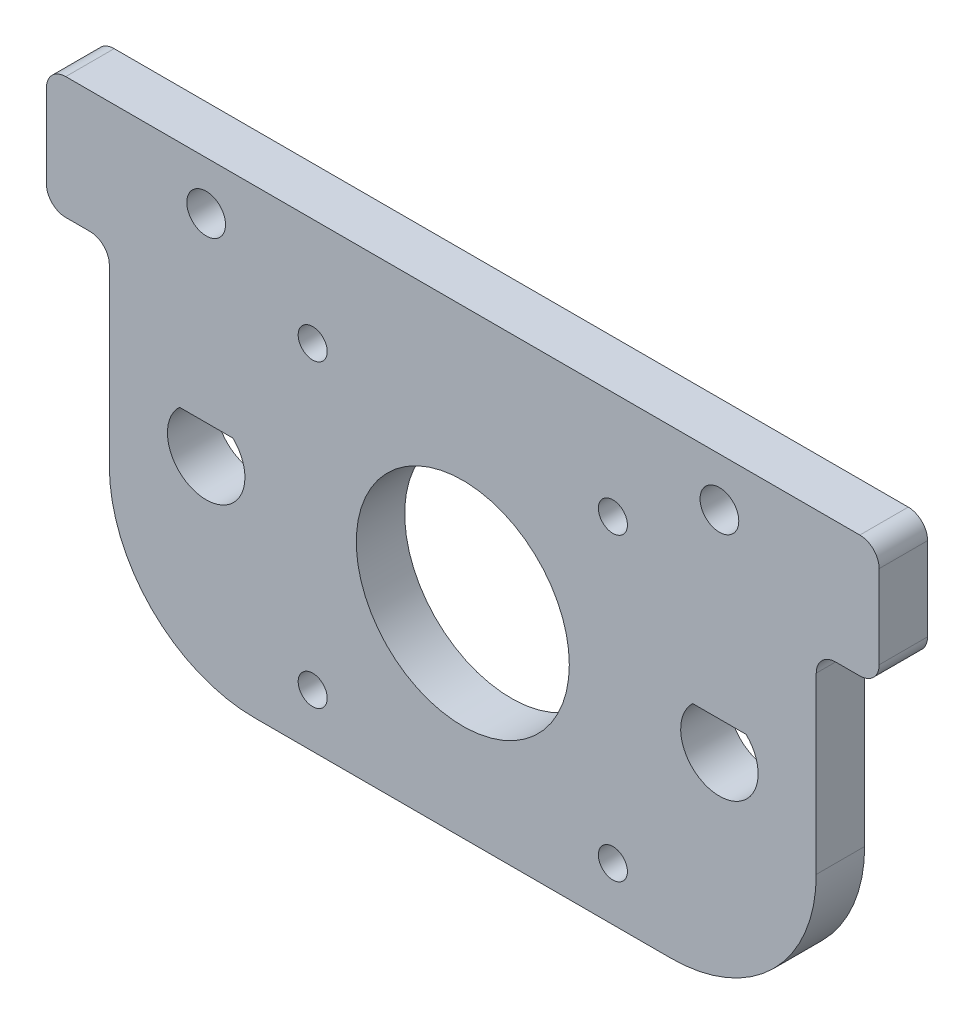
ISO-10303-21;
HEADER;
FILE_DESCRIPTION(('STEP AP214'),'2;1');
FILE_NAME('part.step','',(''),(''),'','','');
FILE_SCHEMA(('AUTOMOTIVE_DESIGN { 1 0 10303 214 1 1 1 1 }'));
ENDSEC;
DATA;
#1=APPLICATION_CONTEXT('core data for automotive mechanical design processes');
#2=APPLICATION_PROTOCOL_DEFINITION('international standard','automotive_design',2000,#1);
#3=PRODUCT_CONTEXT('',#1,'mechanical');
#4=PRODUCT('Part','Part','',(#3));
#5=PRODUCT_RELATED_PRODUCT_CATEGORY('part','',(#4));
#6=PRODUCT_DEFINITION_FORMATION('','',#4);
#7=PRODUCT_DEFINITION_CONTEXT('part definition',#1,'design');
#8=PRODUCT_DEFINITION('design','',#6,#7);
#9=PRODUCT_DEFINITION_SHAPE('','',#8);
#10=(LENGTH_UNIT() NAMED_UNIT(*) SI_UNIT(.MILLI.,.METRE.));
#11=(NAMED_UNIT(*) PLANE_ANGLE_UNIT() SI_UNIT($,.RADIAN.));
#12=(NAMED_UNIT(*) SI_UNIT($,.STERADIAN.) SOLID_ANGLE_UNIT());
#13=UNCERTAINTY_MEASURE_WITH_UNIT(LENGTH_MEASURE(1.E-05),#10,'distance_accuracy_value','');
#14=(GEOMETRIC_REPRESENTATION_CONTEXT(3) GLOBAL_UNCERTAINTY_ASSIGNED_CONTEXT((#13)) GLOBAL_UNIT_ASSIGNED_CONTEXT((#10,
#11,#12)) REPRESENTATION_CONTEXT('',''));
#15=CARTESIAN_POINT('',(0.,0.,0.));
#16=DIRECTION('',(0.,0.,1.));
#17=DIRECTION('',(1.,0.,0.));
#18=AXIS2_PLACEMENT_3D('',#15,#16,#17);
#19=CARTESIAN_POINT('',(0.,0.,5.));
#20=DIRECTION('',(0.,0.,-1.));
#21=DIRECTION('',(-1.,0.,0.));
#22=AXIS2_PLACEMENT_3D('',#19,#20,#21);
#23=PLANE('',#22);
#24=CARTESIAN_POINT('',(69.5,-14.,5.));
#25=DIRECTION('',(0.,0.,1.));
#26=DIRECTION('',(1.,0.,0.));
#27=AXIS2_PLACEMENT_3D('',#24,#25,#26);
#28=CIRCLE('',#27,3.99999999999999);
#29=CARTESIAN_POINT('',(66.7450045372088,-11.1,5.));
#30=VERTEX_POINT('',#29);
#31=CARTESIAN_POINT('',(72.2549954627912,-11.1,5.));
#32=VERTEX_POINT('',#31);
#33=EDGE_CURVE('E196',#30,#32,#28,.T.);
#34=ORIENTED_EDGE('',*,*,#33,.F.);
#35=DIRECTION('',(-1.,0.,0.));
#36=VECTOR('',#35,1.);
#37=CARTESIAN_POINT('',(66.7450045372088,-11.1,5.));
#38=LINE('',#37,#36);
#39=EDGE_CURVE('E199',#32,#30,#38,.T.);
#40=ORIENTED_EDGE('',*,*,#39,.F.);
#41=EDGE_LOOP('',(#34,#40));
#42=FACE_BOUND('',#41,.T.);
#43=DIRECTION('',(1.,0.,0.));
#44=VECTOR('',#43,1.);
#45=CARTESIAN_POINT('',(6.5,-35.,5.));
#46=LINE('',#45,#44);
#47=CARTESIAN_POINT('',(21.5,-35.,5.));
#48=VERTEX_POINT('',#47);
#49=CARTESIAN_POINT('',(64.5,-35.,5.));
#50=VERTEX_POINT('',#49);
#51=EDGE_CURVE('E264',#48,#50,#46,.T.);
#52=ORIENTED_EDGE('',*,*,#51,.T.);
#53=CARTESIAN_POINT('',(64.5,-20.,5.));
#54=DIRECTION('',(0.,0.,-1.));
#55=DIRECTION('',(-1.,0.,0.));
#56=AXIS2_PLACEMENT_3D('',#53,#54,#55);
#57=CIRCLE('',#56,15.);
#58=CARTESIAN_POINT('',(79.5,-20.,5.));
#59=VERTEX_POINT('',#58);
#60=EDGE_CURVE('E41',#50,#59,#57,.F.);
#61=ORIENTED_EDGE('',*,*,#60,.T.);
#62=DIRECTION('',(0.,1.,0.));
#63=VECTOR('',#62,1.);
#64=CARTESIAN_POINT('',(79.5,0.,5.));
#65=LINE('',#64,#63);
#66=CARTESIAN_POINT('',(79.5,-2.,5.));
#67=VERTEX_POINT('',#66);
#68=EDGE_CURVE('E266',#59,#67,#65,.T.);
#69=ORIENTED_EDGE('',*,*,#68,.T.);
#70=CARTESIAN_POINT('',(81.5,-2.,5.));
#71=DIRECTION('',(0.,0.,-1.));
#72=DIRECTION('',(-1.,0.,0.));
#73=AXIS2_PLACEMENT_3D('',#70,#71,#72);
#74=CIRCLE('',#73,2.);
#75=CARTESIAN_POINT('',(81.5,0.,5.));
#76=VERTEX_POINT('',#75);
#77=EDGE_CURVE('E350',#67,#76,#74,.T.);
#78=ORIENTED_EDGE('',*,*,#77,.T.);
#79=DIRECTION('',(1.,0.,0.));
#80=VECTOR('',#79,1.);
#81=CARTESIAN_POINT('',(79.5,0.,5.));
#82=LINE('',#81,#80);
#83=CARTESIAN_POINT('',(84.,0.,5.));
#84=VERTEX_POINT('',#83);
#85=EDGE_CURVE('E268',#76,#84,#82,.T.);
#86=ORIENTED_EDGE('',*,*,#85,.T.);
#87=CARTESIAN_POINT('',(84.,2.,5.));
#88=DIRECTION('',(0.,0.,-1.));
#89=DIRECTION('',(-1.,0.,0.));
#90=AXIS2_PLACEMENT_3D('',#87,#88,#89);
#91=CIRCLE('',#90,2.);
#92=CARTESIAN_POINT('',(86.,2.,5.));
#93=VERTEX_POINT('',#92);
#94=EDGE_CURVE('E331',#84,#93,#91,.F.);
#95=ORIENTED_EDGE('',*,*,#94,.T.);
#96=DIRECTION('',(0.,1.,0.));
#97=VECTOR('',#96,1.);
#98=CARTESIAN_POINT('',(86.,0.,5.));
#99=LINE('',#98,#97);
#100=CARTESIAN_POINT('',(86.,10.6,5.));
#101=VERTEX_POINT('',#100);
#102=EDGE_CURVE('E271',#93,#101,#99,.T.);
#103=ORIENTED_EDGE('',*,*,#102,.T.);
#104=CARTESIAN_POINT('',(84.,10.6,5.));
#105=DIRECTION('',(0.,0.,-1.));
#106=DIRECTION('',(-1.,0.,0.));
#107=AXIS2_PLACEMENT_3D('',#104,#105,#106);
#108=CIRCLE('',#107,2.);
#109=CARTESIAN_POINT('',(84.,12.6,5.));
#110=VERTEX_POINT('',#109);
#111=EDGE_CURVE('E327',#101,#110,#108,.F.);
#112=ORIENTED_EDGE('',*,*,#111,.T.);
#113=DIRECTION('',(-1.,0.,0.));
#114=VECTOR('',#113,1.);
#115=CARTESIAN_POINT('',(0.,12.6,5.));
#116=LINE('',#115,#114);
#117=CARTESIAN_POINT('',(2.,12.6,5.));
#118=VERTEX_POINT('',#117);
#119=EDGE_CURVE('E274',#110,#118,#116,.T.);
#120=ORIENTED_EDGE('',*,*,#119,.T.);
#121=CARTESIAN_POINT('',(2.,10.6,5.));
#122=DIRECTION('',(0.,0.,-1.));
#123=DIRECTION('',(-1.,0.,0.));
#124=AXIS2_PLACEMENT_3D('',#121,#122,#123);
#125=CIRCLE('',#124,2.);
#126=CARTESIAN_POINT('',(0.,10.6,5.));
#127=VERTEX_POINT('',#126);
#128=EDGE_CURVE('E325',#118,#127,#125,.F.);
#129=ORIENTED_EDGE('',*,*,#128,.T.);
#130=DIRECTION('',(0.,-1.,0.));
#131=VECTOR('',#130,1.);
#132=CARTESIAN_POINT('',(0.,0.,5.));
#133=LINE('',#132,#131);
#134=CARTESIAN_POINT('',(0.,2.,5.));
#135=VERTEX_POINT('',#134);
#136=EDGE_CURVE('E255',#127,#135,#133,.T.);
#137=ORIENTED_EDGE('',*,*,#136,.T.);
#138=CARTESIAN_POINT('',(2.,2.,5.));
#139=DIRECTION('',(0.,0.,-1.));
#140=DIRECTION('',(-1.,0.,0.));
#141=AXIS2_PLACEMENT_3D('',#138,#139,#140);
#142=CIRCLE('',#141,2.);
#143=CARTESIAN_POINT('',(2.,0.,5.));
#144=VERTEX_POINT('',#143);
#145=EDGE_CURVE('E329',#135,#144,#142,.F.);
#146=ORIENTED_EDGE('',*,*,#145,.T.);
#147=DIRECTION('',(1.,0.,0.));
#148=VECTOR('',#147,1.);
#149=CARTESIAN_POINT('',(0.,0.,5.));
#150=LINE('',#149,#148);
#151=CARTESIAN_POINT('',(4.5,0.,5.));
#152=VERTEX_POINT('',#151);
#153=EDGE_CURVE('E258',#144,#152,#150,.T.);
#154=ORIENTED_EDGE('',*,*,#153,.T.);
#155=CARTESIAN_POINT('',(4.5,-2.,5.));
#156=DIRECTION('',(0.,0.,-1.));
#157=DIRECTION('',(-1.,0.,0.));
#158=AXIS2_PLACEMENT_3D('',#155,#156,#157);
#159=CIRCLE('',#158,2.);
#160=CARTESIAN_POINT('',(6.5,-2.,5.));
#161=VERTEX_POINT('',#160);
#162=EDGE_CURVE('E345',#152,#161,#159,.T.);
#163=ORIENTED_EDGE('',*,*,#162,.T.);
#164=DIRECTION('',(0.,-1.,0.));
#165=VECTOR('',#164,1.);
#166=CARTESIAN_POINT('',(6.5,0.,5.));
#167=LINE('',#166,#165);
#168=CARTESIAN_POINT('',(6.5,-20.,5.));
#169=VERTEX_POINT('',#168);
#170=EDGE_CURVE('E262',#161,#169,#167,.T.);
#171=ORIENTED_EDGE('',*,*,#170,.T.);
#172=CARTESIAN_POINT('',(21.5,-20.,5.));
#173=DIRECTION('',(0.,0.,-1.));
#174=DIRECTION('',(-1.,0.,0.));
#175=AXIS2_PLACEMENT_3D('',#172,#173,#174);
#176=CIRCLE('',#175,15.);
#177=EDGE_CURVE('E363',#169,#48,#176,.F.);
#178=ORIENTED_EDGE('',*,*,#177,.T.);
#179=EDGE_LOOP('',(#52,#61,#69,#78,#86,#95,#103,#112,#120,#129,#137,#146,#154,#163,#171,#178));
#180=FACE_BOUND('',#179,.T.);
#181=CARTESIAN_POINT('',(69.5,7.6,5.));
#182=DIRECTION('',(0.,0.,1.));
#183=DIRECTION('',(1.,0.,0.));
#184=AXIS2_PLACEMENT_3D('',#181,#182,#183);
#185=CIRCLE('',#184,2.);
#186=CARTESIAN_POINT('',(71.5,7.6,5.));
#187=VERTEX_POINT('',#186);
#188=EDGE_CURVE('E249',#187,#187,#185,.T.);
#189=ORIENTED_EDGE('',*,*,#188,.F.);
#190=EDGE_LOOP('',(#189));
#191=FACE_BOUND('',#190,.T.);
#192=CARTESIAN_POINT('',(16.5,7.6,5.));
#193=DIRECTION('',(0.,0.,1.));
#194=DIRECTION('',(1.,0.,0.));
#195=AXIS2_PLACEMENT_3D('',#192,#193,#194);
#196=CIRCLE('',#195,2.);
#197=CARTESIAN_POINT('',(18.5,7.6,5.));
#198=VERTEX_POINT('',#197);
#199=EDGE_CURVE('E243',#198,#198,#196,.T.);
#200=ORIENTED_EDGE('',*,*,#199,.F.);
#201=EDGE_LOOP('',(#200));
#202=FACE_BOUND('',#201,.T.);
#203=CARTESIAN_POINT('',(27.5,-29.5,5.));
#204=DIRECTION('',(0.,0.,1.));
#205=DIRECTION('',(1.,0.,0.));
#206=AXIS2_PLACEMENT_3D('',#203,#204,#205);
#207=CIRCLE('',#206,1.5);
#208=CARTESIAN_POINT('',(29.,-29.5,5.));
#209=VERTEX_POINT('',#208);
#210=EDGE_CURVE('E237',#209,#209,#207,.T.);
#211=ORIENTED_EDGE('',*,*,#210,.F.);
#212=EDGE_LOOP('',(#211));
#213=FACE_BOUND('',#212,.T.);
#214=CARTESIAN_POINT('',(43.,-14.,5.));
#215=DIRECTION('',(0.,0.,1.));
#216=DIRECTION('',(1.,0.,0.));
#217=AXIS2_PLACEMENT_3D('',#214,#215,#216);
#218=CIRCLE('',#217,11.);
#219=CARTESIAN_POINT('',(54.,-14.,5.));
#220=VERTEX_POINT('',#219);
#221=EDGE_CURVE('E231',#220,#220,#218,.T.);
#222=ORIENTED_EDGE('',*,*,#221,.F.);
#223=EDGE_LOOP('',(#222));
#224=FACE_BOUND('',#223,.T.);
#225=CARTESIAN_POINT('',(58.5,-29.5,5.));
#226=DIRECTION('',(0.,0.,1.));
#227=DIRECTION('',(1.,0.,0.));
#228=AXIS2_PLACEMENT_3D('',#225,#226,#227);
#229=CIRCLE('',#228,1.5);
#230=CARTESIAN_POINT('',(60.,-29.5,5.));
#231=VERTEX_POINT('',#230);
#232=EDGE_CURVE('E225',#231,#231,#229,.T.);
#233=ORIENTED_EDGE('',*,*,#232,.F.);
#234=EDGE_LOOP('',(#233));
#235=FACE_BOUND('',#234,.T.);
#236=CARTESIAN_POINT('',(27.5,1.5,5.));
#237=DIRECTION('',(0.,0.,1.));
#238=DIRECTION('',(1.,0.,0.));
#239=AXIS2_PLACEMENT_3D('',#236,#237,#238);
#240=CIRCLE('',#239,1.5);
#241=CARTESIAN_POINT('',(29.,1.5,5.));
#242=VERTEX_POINT('',#241);
#243=EDGE_CURVE('E219',#242,#242,#240,.T.);
#244=ORIENTED_EDGE('',*,*,#243,.F.);
#245=EDGE_LOOP('',(#244));
#246=FACE_BOUND('',#245,.T.);
#247=CARTESIAN_POINT('',(58.5,1.5,5.));
#248=DIRECTION('',(0.,0.,1.));
#249=DIRECTION('',(1.,0.,0.));
#250=AXIS2_PLACEMENT_3D('',#247,#248,#249);
#251=CIRCLE('',#250,1.5);
#252=CARTESIAN_POINT('',(60.,1.5,5.));
#253=VERTEX_POINT('',#252);
#254=EDGE_CURVE('E213',#253,#253,#251,.T.);
#255=ORIENTED_EDGE('',*,*,#254,.F.);
#256=EDGE_LOOP('',(#255));
#257=FACE_BOUND('',#256,.T.);
#258=CARTESIAN_POINT('',(16.5,-14.,5.));
#259=DIRECTION('',(0.,0.,1.));
#260=DIRECTION('',(1.,0.,0.));
#261=AXIS2_PLACEMENT_3D('',#258,#259,#260);
#262=CIRCLE('',#261,3.99999999999999);
#263=CARTESIAN_POINT('',(13.7450045372088,-11.1,5.));
#264=VERTEX_POINT('',#263);
#265=CARTESIAN_POINT('',(19.2549954627912,-11.1,5.));
#266=VERTEX_POINT('',#265);
#267=EDGE_CURVE('E182',#264,#266,#262,.T.);
#268=ORIENTED_EDGE('',*,*,#267,.F.);
#269=DIRECTION('',(-1.,0.,0.));
#270=VECTOR('',#269,1.);
#271=CARTESIAN_POINT('',(13.7450045372088,-11.1,5.));
#272=LINE('',#271,#270);
#273=EDGE_CURVE('E172',#266,#264,#272,.T.);
#274=ORIENTED_EDGE('',*,*,#273,.F.);
#275=EDGE_LOOP('',(#268,#274));
#276=FACE_BOUND('',#275,.T.);
#277=ADVANCED_FACE('F33',(#42,#180,#191,#202,#213,#224,#235,#246,#257,#276),#23,.F.);
#278=CARTESIAN_POINT('',(0.,0.,0.));
#279=DIRECTION('',(0.,0.,-1.));
#280=DIRECTION('',(-1.,0.,0.));
#281=AXIS2_PLACEMENT_3D('',#278,#279,#280);
#282=PLANE('',#281);
#283=CARTESIAN_POINT('',(27.5,1.5,0.));
#284=DIRECTION('',(0.,0.,1.));
#285=DIRECTION('',(1.,0.,0.));
#286=AXIS2_PLACEMENT_3D('',#283,#284,#285);
#287=CIRCLE('',#286,1.5);
#288=CARTESIAN_POINT('',(29.,1.5,0.));
#289=VERTEX_POINT('',#288);
#290=EDGE_CURVE('E216',#289,#289,#287,.T.);
#291=ORIENTED_EDGE('',*,*,#290,.T.);
#292=EDGE_LOOP('',(#291));
#293=FACE_BOUND('',#292,.T.);
#294=CARTESIAN_POINT('',(43.,-14.,0.));
#295=DIRECTION('',(0.,0.,1.));
#296=DIRECTION('',(1.,0.,0.));
#297=AXIS2_PLACEMENT_3D('',#294,#295,#296);
#298=CIRCLE('',#297,11.);
#299=CARTESIAN_POINT('',(54.,-14.,0.));
#300=VERTEX_POINT('',#299);
#301=EDGE_CURVE('E228',#300,#300,#298,.T.);
#302=ORIENTED_EDGE('',*,*,#301,.T.);
#303=EDGE_LOOP('',(#302));
#304=FACE_BOUND('',#303,.T.);
#305=CARTESIAN_POINT('',(16.5,7.6,0.));
#306=DIRECTION('',(0.,0.,1.));
#307=DIRECTION('',(1.,0.,0.));
#308=AXIS2_PLACEMENT_3D('',#305,#306,#307);
#309=CIRCLE('',#308,2.);
#310=CARTESIAN_POINT('',(18.5,7.6,0.));
#311=VERTEX_POINT('',#310);
#312=EDGE_CURVE('E240',#311,#311,#309,.T.);
#313=ORIENTED_EDGE('',*,*,#312,.T.);
#314=EDGE_LOOP('',(#313));
#315=FACE_BOUND('',#314,.T.);
#316=DIRECTION('',(0.,1.,0.));
#317=VECTOR('',#316,1.);
#318=CARTESIAN_POINT('',(79.5,0.,0.));
#319=LINE('',#318,#317);
#320=CARTESIAN_POINT('',(79.5,-20.,0.));
#321=VERTEX_POINT('',#320);
#322=CARTESIAN_POINT('',(79.5,-2.,0.));
#323=VERTEX_POINT('',#322);
#324=EDGE_CURVE('E287',#321,#323,#319,.T.);
#325=ORIENTED_EDGE('',*,*,#324,.F.);
#326=CARTESIAN_POINT('',(64.5,-20.,0.));
#327=DIRECTION('',(0.,0.,-1.));
#328=DIRECTION('',(-1.,0.,0.));
#329=AXIS2_PLACEMENT_3D('',#326,#327,#328);
#330=CIRCLE('',#329,15.);
#331=CARTESIAN_POINT('',(64.5,-35.,0.));
#332=VERTEX_POINT('',#331);
#333=EDGE_CURVE('E357',#321,#332,#330,.T.);
#334=ORIENTED_EDGE('',*,*,#333,.T.);
#335=DIRECTION('',(1.,0.,0.));
#336=VECTOR('',#335,1.);
#337=CARTESIAN_POINT('',(6.5,-35.,0.));
#338=LINE('',#337,#336);
#339=CARTESIAN_POINT('',(21.5,-35.,0.));
#340=VERTEX_POINT('',#339);
#341=EDGE_CURVE('E285',#340,#332,#338,.T.);
#342=ORIENTED_EDGE('',*,*,#341,.F.);
#343=CARTESIAN_POINT('',(21.5,-20.,0.));
#344=DIRECTION('',(0.,0.,-1.));
#345=DIRECTION('',(-1.,0.,0.));
#346=AXIS2_PLACEMENT_3D('',#343,#344,#345);
#347=CIRCLE('',#346,15.);
#348=CARTESIAN_POINT('',(6.5,-20.,0.));
#349=VERTEX_POINT('',#348);
#350=EDGE_CURVE('E355',#340,#349,#347,.T.);
#351=ORIENTED_EDGE('',*,*,#350,.T.);
#352=DIRECTION('',(0.,-1.,0.));
#353=VECTOR('',#352,1.);
#354=CARTESIAN_POINT('',(6.5,0.,0.));
#355=LINE('',#354,#353);
#356=CARTESIAN_POINT('',(6.5,-2.,0.));
#357=VERTEX_POINT('',#356);
#358=EDGE_CURVE('E283',#357,#349,#355,.T.);
#359=ORIENTED_EDGE('',*,*,#358,.F.);
#360=CARTESIAN_POINT('',(4.5,-2.,0.));
#361=DIRECTION('',(0.,0.,-1.));
#362=DIRECTION('',(-1.,0.,0.));
#363=AXIS2_PLACEMENT_3D('',#360,#361,#362);
#364=CIRCLE('',#363,2.);
#365=CARTESIAN_POINT('',(4.5,0.,0.));
#366=VERTEX_POINT('',#365);
#367=EDGE_CURVE('E343',#357,#366,#364,.F.);
#368=ORIENTED_EDGE('',*,*,#367,.T.);
#369=DIRECTION('',(1.,0.,0.));
#370=VECTOR('',#369,1.);
#371=CARTESIAN_POINT('',(0.,0.,0.));
#372=LINE('',#371,#370);
#373=CARTESIAN_POINT('',(2.,0.,0.));
#374=VERTEX_POINT('',#373);
#375=EDGE_CURVE('E280',#374,#366,#372,.T.);
#376=ORIENTED_EDGE('',*,*,#375,.F.);
#377=CARTESIAN_POINT('',(2.,2.,0.));
#378=DIRECTION('',(0.,0.,-1.));
#379=DIRECTION('',(-1.,0.,0.));
#380=AXIS2_PLACEMENT_3D('',#377,#378,#379);
#381=CIRCLE('',#380,2.);
#382=CARTESIAN_POINT('',(0.,2.,0.));
#383=VERTEX_POINT('',#382);
#384=EDGE_CURVE('E321',#374,#383,#381,.T.);
#385=ORIENTED_EDGE('',*,*,#384,.T.);
#386=DIRECTION('',(0.,-1.,0.));
#387=VECTOR('',#386,1.);
#388=CARTESIAN_POINT('',(0.,0.,0.));
#389=LINE('',#388,#387);
#390=CARTESIAN_POINT('',(0.,10.6,0.));
#391=VERTEX_POINT('',#390);
#392=EDGE_CURVE('E252',#391,#383,#389,.T.);
#393=ORIENTED_EDGE('',*,*,#392,.F.);
#394=CARTESIAN_POINT('',(2.,10.6,0.));
#395=DIRECTION('',(0.,0.,-1.));
#396=DIRECTION('',(-1.,0.,0.));
#397=AXIS2_PLACEMENT_3D('',#394,#395,#396);
#398=CIRCLE('',#397,2.);
#399=CARTESIAN_POINT('',(2.,12.6,0.));
#400=VERTEX_POINT('',#399);
#401=EDGE_CURVE('E317',#391,#400,#398,.T.);
#402=ORIENTED_EDGE('',*,*,#401,.T.);
#403=DIRECTION('',(-1.,0.,0.));
#404=VECTOR('',#403,1.);
#405=CARTESIAN_POINT('',(0.,12.6,0.));
#406=LINE('',#405,#404);
#407=CARTESIAN_POINT('',(84.,12.6,0.));
#408=VERTEX_POINT('',#407);
#409=EDGE_CURVE('E259',#408,#400,#406,.T.);
#410=ORIENTED_EDGE('',*,*,#409,.F.);
#411=CARTESIAN_POINT('',(84.,10.6,0.));
#412=DIRECTION('',(0.,0.,-1.));
#413=DIRECTION('',(-1.,0.,0.));
#414=AXIS2_PLACEMENT_3D('',#411,#412,#413);
#415=CIRCLE('',#414,2.);
#416=CARTESIAN_POINT('',(86.,10.6,0.));
#417=VERTEX_POINT('',#416);
#418=EDGE_CURVE('E319',#408,#417,#415,.T.);
#419=ORIENTED_EDGE('',*,*,#418,.T.);
#420=DIRECTION('',(0.,1.,0.));
#421=VECTOR('',#420,1.);
#422=CARTESIAN_POINT('',(86.,0.,0.));
#423=LINE('',#422,#421);
#424=CARTESIAN_POINT('',(86.,2.,0.));
#425=VERTEX_POINT('',#424);
#426=EDGE_CURVE('E292',#425,#417,#423,.T.);
#427=ORIENTED_EDGE('',*,*,#426,.F.);
#428=CARTESIAN_POINT('',(84.,2.,0.));
#429=DIRECTION('',(0.,0.,-1.));
#430=DIRECTION('',(-1.,0.,0.));
#431=AXIS2_PLACEMENT_3D('',#428,#429,#430);
#432=CIRCLE('',#431,2.);
#433=CARTESIAN_POINT('',(84.,0.,0.));
#434=VERTEX_POINT('',#433);
#435=EDGE_CURVE('E323',#425,#434,#432,.T.);
#436=ORIENTED_EDGE('',*,*,#435,.T.);
#437=DIRECTION('',(1.,0.,0.));
#438=VECTOR('',#437,1.);
#439=CARTESIAN_POINT('',(79.5,0.,0.));
#440=LINE('',#439,#438);
#441=CARTESIAN_POINT('',(81.5,0.,0.));
#442=VERTEX_POINT('',#441);
#443=EDGE_CURVE('E289',#442,#434,#440,.T.);
#444=ORIENTED_EDGE('',*,*,#443,.F.);
#445=CARTESIAN_POINT('',(81.5,-2.,0.));
#446=DIRECTION('',(0.,0.,-1.));
#447=DIRECTION('',(-1.,0.,0.));
#448=AXIS2_PLACEMENT_3D('',#445,#446,#447);
#449=CIRCLE('',#448,2.);
#450=EDGE_CURVE('E347',#442,#323,#449,.F.);
#451=ORIENTED_EDGE('',*,*,#450,.T.);
#452=EDGE_LOOP('',(#325,#334,#342,#351,#359,#368,#376,#385,#393,#402,#410,#419,#427,#436,#444,#451));
#453=FACE_BOUND('',#452,.T.);
#454=CARTESIAN_POINT('',(69.5,7.6,0.));
#455=DIRECTION('',(0.,0.,1.));
#456=DIRECTION('',(1.,0.,0.));
#457=AXIS2_PLACEMENT_3D('',#454,#455,#456);
#458=CIRCLE('',#457,2.);
#459=CARTESIAN_POINT('',(71.5,7.6,0.));
#460=VERTEX_POINT('',#459);
#461=EDGE_CURVE('E246',#460,#460,#458,.T.);
#462=ORIENTED_EDGE('',*,*,#461,.T.);
#463=EDGE_LOOP('',(#462));
#464=FACE_BOUND('',#463,.T.);
#465=CARTESIAN_POINT('',(27.5,-29.5,0.));
#466=DIRECTION('',(0.,0.,1.));
#467=DIRECTION('',(1.,0.,0.));
#468=AXIS2_PLACEMENT_3D('',#465,#466,#467);
#469=CIRCLE('',#468,1.5);
#470=CARTESIAN_POINT('',(29.,-29.5,0.));
#471=VERTEX_POINT('',#470);
#472=EDGE_CURVE('E234',#471,#471,#469,.T.);
#473=ORIENTED_EDGE('',*,*,#472,.T.);
#474=EDGE_LOOP('',(#473));
#475=FACE_BOUND('',#474,.T.);
#476=CARTESIAN_POINT('',(58.5,-29.5,0.));
#477=DIRECTION('',(0.,0.,1.));
#478=DIRECTION('',(1.,0.,0.));
#479=AXIS2_PLACEMENT_3D('',#476,#477,#478);
#480=CIRCLE('',#479,1.5);
#481=CARTESIAN_POINT('',(60.,-29.5,0.));
#482=VERTEX_POINT('',#481);
#483=EDGE_CURVE('E222',#482,#482,#480,.T.);
#484=ORIENTED_EDGE('',*,*,#483,.T.);
#485=EDGE_LOOP('',(#484));
#486=FACE_BOUND('',#485,.T.);
#487=CARTESIAN_POINT('',(58.5,1.5,0.));
#488=DIRECTION('',(0.,0.,1.));
#489=DIRECTION('',(1.,0.,0.));
#490=AXIS2_PLACEMENT_3D('',#487,#488,#489);
#491=CIRCLE('',#490,1.5);
#492=CARTESIAN_POINT('',(60.,1.5,0.));
#493=VERTEX_POINT('',#492);
#494=EDGE_CURVE('E212',#493,#493,#491,.T.);
#495=ORIENTED_EDGE('',*,*,#494,.T.);
#496=EDGE_LOOP('',(#495));
#497=FACE_BOUND('',#496,.T.);
#498=DIRECTION('',(-1.,0.,0.));
#499=VECTOR('',#498,1.);
#500=CARTESIAN_POINT('',(66.7450045372088,-11.1,0.));
#501=LINE('',#500,#499);
#502=CARTESIAN_POINT('',(72.2549954627912,-11.1,0.));
#503=VERTEX_POINT('',#502);
#504=CARTESIAN_POINT('',(66.7450045372088,-11.1,0.));
#505=VERTEX_POINT('',#504);
#506=EDGE_CURVE('E200',#503,#505,#501,.T.);
#507=ORIENTED_EDGE('',*,*,#506,.T.);
#508=CARTESIAN_POINT('',(69.5,-14.,0.));
#509=DIRECTION('',(0.,0.,1.));
#510=DIRECTION('',(1.,0.,0.));
#511=AXIS2_PLACEMENT_3D('',#508,#509,#510);
#512=CIRCLE('',#511,3.99999999999999);
#513=EDGE_CURVE('E195',#505,#503,#512,.T.);
#514=ORIENTED_EDGE('',*,*,#513,.T.);
#515=EDGE_LOOP('',(#507,#514));
#516=FACE_BOUND('',#515,.T.);
#517=DIRECTION('',(-1.,0.,0.));
#518=VECTOR('',#517,1.);
#519=CARTESIAN_POINT('',(13.7450045372088,-11.1,0.));
#520=LINE('',#519,#518);
#521=CARTESIAN_POINT('',(19.2549954627912,-11.1,0.));
#522=VERTEX_POINT('',#521);
#523=CARTESIAN_POINT('',(13.7450045372088,-11.1,0.));
#524=VERTEX_POINT('',#523);
#525=EDGE_CURVE('E189',#522,#524,#520,.T.);
#526=ORIENTED_EDGE('',*,*,#525,.T.);
#527=CARTESIAN_POINT('',(16.5,-14.,0.));
#528=DIRECTION('',(0.,0.,1.));
#529=DIRECTION('',(1.,0.,0.));
#530=AXIS2_PLACEMENT_3D('',#527,#528,#529);
#531=CIRCLE('',#530,3.99999999999999);
#532=EDGE_CURVE('E187',#524,#522,#531,.T.);
#533=ORIENTED_EDGE('',*,*,#532,.T.);
#534=EDGE_LOOP('',(#526,#533));
#535=FACE_BOUND('',#534,.T.);
#536=ADVANCED_FACE('F378',(#293,#304,#315,#453,#464,#475,#486,#497,#516,#535),#282,.T.);
#537=CARTESIAN_POINT('',(0.,0.,5.));
#538=DIRECTION('',(1.,0.,0.));
#539=DIRECTION('',(0.,0.,-1.));
#540=AXIS2_PLACEMENT_3D('',#537,#538,#539);
#541=PLANE('',#540);
#542=ORIENTED_EDGE('',*,*,#392,.T.);
#543=DIRECTION('',(0.,0.,-1.));
#544=VECTOR('',#543,1.);
#545=CARTESIAN_POINT('',(0.,2.,5.));
#546=LINE('',#545,#544);
#547=EDGE_CURVE('E336',#383,#135,#546,.F.);
#548=ORIENTED_EDGE('',*,*,#547,.T.);
#549=ORIENTED_EDGE('',*,*,#136,.F.);
#550=DIRECTION('',(0.,0.,-1.));
#551=VECTOR('',#550,1.);
#552=CARTESIAN_POINT('',(0.,10.6,5.));
#553=LINE('',#552,#551);
#554=EDGE_CURVE('E333',#127,#391,#553,.T.);
#555=ORIENTED_EDGE('',*,*,#554,.T.);
#556=EDGE_LOOP('',(#542,#548,#549,#555));
#557=FACE_BOUND('',#556,.T.);
#558=ADVANCED_FACE('F402',(#557),#541,.F.);
#559=CARTESIAN_POINT('',(0.,0.,5.));
#560=DIRECTION('',(0.,1.,0.));
#561=DIRECTION('',(0.,0.,1.));
#562=AXIS2_PLACEMENT_3D('',#559,#560,#561);
#563=PLANE('',#562);
#564=ORIENTED_EDGE('',*,*,#375,.T.);
#565=DIRECTION('',(0.,0.,-1.));
#566=VECTOR('',#565,1.);
#567=CARTESIAN_POINT('',(4.5,0.,5.));
#568=LINE('',#567,#566);
#569=EDGE_CURVE('E302',#366,#152,#568,.F.);
#570=ORIENTED_EDGE('',*,*,#569,.T.);
#571=ORIENTED_EDGE('',*,*,#153,.F.);
#572=DIRECTION('',(0.,0.,-1.));
#573=VECTOR('',#572,1.);
#574=CARTESIAN_POINT('',(2.,0.,5.));
#575=LINE('',#574,#573);
#576=EDGE_CURVE('E299',#144,#374,#575,.T.);
#577=ORIENTED_EDGE('',*,*,#576,.T.);
#578=EDGE_LOOP('',(#564,#570,#571,#577));
#579=FACE_BOUND('',#578,.T.);
#580=ADVANCED_FACE('F393',(#579),#563,.F.);
#581=CARTESIAN_POINT('',(6.5,0.,5.));
#582=DIRECTION('',(1.,0.,0.));
#583=DIRECTION('',(0.,1.,0.));
#584=AXIS2_PLACEMENT_3D('',#581,#582,#583);
#585=PLANE('',#584);
#586=ORIENTED_EDGE('',*,*,#358,.T.);
#587=DIRECTION('',(0.,0.,-1.));
#588=VECTOR('',#587,1.);
#589=CARTESIAN_POINT('',(6.5,-20.,5.));
#590=LINE('',#589,#588);
#591=EDGE_CURVE('E11',#349,#169,#590,.F.);
#592=ORIENTED_EDGE('',*,*,#591,.T.);
#593=ORIENTED_EDGE('',*,*,#170,.F.);
#594=DIRECTION('',(0.,0.,-1.));
#595=VECTOR('',#594,1.);
#596=CARTESIAN_POINT('',(6.5,-2.,0.));
#597=LINE('',#596,#595);
#598=EDGE_CURVE('E277',#161,#357,#597,.T.);
#599=ORIENTED_EDGE('',*,*,#598,.T.);
#600=EDGE_LOOP('',(#586,#592,#593,#599));
#601=FACE_BOUND('',#600,.T.);
#602=ADVANCED_FACE('F385',(#601),#585,.F.);
#603=CARTESIAN_POINT('',(6.5,-35.,5.));
#604=DIRECTION('',(0.,1.,0.));
#605=DIRECTION('',(-1.,0.,0.));
#606=AXIS2_PLACEMENT_3D('',#603,#604,#605);
#607=PLANE('',#606);
#608=ORIENTED_EDGE('',*,*,#341,.T.);
#609=DIRECTION('',(0.,0.,-1.));
#610=VECTOR('',#609,1.);
#611=CARTESIAN_POINT('',(64.5,-35.,5.));
#612=LINE('',#611,#610);
#613=EDGE_CURVE('E54',#332,#50,#612,.F.);
#614=ORIENTED_EDGE('',*,*,#613,.T.);
#615=ORIENTED_EDGE('',*,*,#51,.F.);
#616=DIRECTION('',(0.,0.,-1.));
#617=VECTOR('',#616,1.);
#618=CARTESIAN_POINT('',(21.5,-35.,5.));
#619=LINE('',#618,#617);
#620=EDGE_CURVE('E359',#48,#340,#619,.T.);
#621=ORIENTED_EDGE('',*,*,#620,.T.);
#622=EDGE_LOOP('',(#608,#614,#615,#621));
#623=FACE_BOUND('',#622,.T.);
#624=ADVANCED_FACE('F380',(#623),#607,.F.);
#625=CARTESIAN_POINT('',(79.5,0.,5.));
#626=DIRECTION('',(-1.,0.,0.));
#627=DIRECTION('',(0.,0.,1.));
#628=AXIS2_PLACEMENT_3D('',#625,#626,#627);
#629=PLANE('',#628);
#630=ORIENTED_EDGE('',*,*,#68,.F.);
#631=DIRECTION('',(0.,0.,-1.));
#632=VECTOR('',#631,1.);
#633=CARTESIAN_POINT('',(79.5,-20.,5.));
#634=LINE('',#633,#632);
#635=EDGE_CURVE('E352',#59,#321,#634,.T.);
#636=ORIENTED_EDGE('',*,*,#635,.T.);
#637=ORIENTED_EDGE('',*,*,#324,.T.);
#638=DIRECTION('',(0.,0.,-1.));
#639=VECTOR('',#638,1.);
#640=CARTESIAN_POINT('',(79.5,-2.,5.));
#641=LINE('',#640,#639);
#642=EDGE_CURVE('E309',#323,#67,#641,.F.);
#643=ORIENTED_EDGE('',*,*,#642,.T.);
#644=EDGE_LOOP('',(#630,#636,#637,#643));
#645=FACE_BOUND('',#644,.T.);
#646=ADVANCED_FACE('F371',(#645),#629,.F.);
#647=CARTESIAN_POINT('',(79.5,0.,5.));
#648=DIRECTION('',(0.,1.,0.));
#649=DIRECTION('',(-1.,0.,0.));
#650=AXIS2_PLACEMENT_3D('',#647,#648,#649);
#651=PLANE('',#650);
#652=ORIENTED_EDGE('',*,*,#85,.F.);
#653=DIRECTION('',(0.,0.,-1.));
#654=VECTOR('',#653,1.);
#655=CARTESIAN_POINT('',(81.5,0.,0.));
#656=LINE('',#655,#654);
#657=EDGE_CURVE('E306',#76,#442,#656,.T.);
#658=ORIENTED_EDGE('',*,*,#657,.T.);
#659=ORIENTED_EDGE('',*,*,#443,.T.);
#660=DIRECTION('',(0.,0.,-1.));
#661=VECTOR('',#660,1.);
#662=CARTESIAN_POINT('',(84.,0.,5.));
#663=LINE('',#662,#661);
#664=EDGE_CURVE('E304',#434,#84,#663,.F.);
#665=ORIENTED_EDGE('',*,*,#664,.T.);
#666=EDGE_LOOP('',(#652,#658,#659,#665));
#667=FACE_BOUND('',#666,.T.);
#668=ADVANCED_FACE('F430',(#667),#651,.F.);
#669=CARTESIAN_POINT('',(86.,0.,5.));
#670=DIRECTION('',(-1.,0.,0.));
#671=DIRECTION('',(0.,0.,1.));
#672=AXIS2_PLACEMENT_3D('',#669,#670,#671);
#673=PLANE('',#672);
#674=ORIENTED_EDGE('',*,*,#102,.F.);
#675=DIRECTION('',(0.,0.,-1.));
#676=VECTOR('',#675,1.);
#677=CARTESIAN_POINT('',(86.,2.,5.));
#678=LINE('',#677,#676);
#679=EDGE_CURVE('E314',#93,#425,#678,.T.);
#680=ORIENTED_EDGE('',*,*,#679,.T.);
#681=ORIENTED_EDGE('',*,*,#426,.T.);
#682=DIRECTION('',(0.,0.,-1.));
#683=VECTOR('',#682,1.);
#684=CARTESIAN_POINT('',(86.,10.6,5.));
#685=LINE('',#684,#683);
#686=EDGE_CURVE('E312',#417,#101,#685,.F.);
#687=ORIENTED_EDGE('',*,*,#686,.T.);
#688=EDGE_LOOP('',(#674,#680,#681,#687));
#689=FACE_BOUND('',#688,.T.);
#690=ADVANCED_FACE('F421',(#689),#673,.F.);
#691=CARTESIAN_POINT('',(0.,12.6,5.));
#692=DIRECTION('',(0.,-1.,0.));
#693=DIRECTION('',(1.,0.,0.));
#694=AXIS2_PLACEMENT_3D('',#691,#692,#693);
#695=PLANE('',#694);
#696=ORIENTED_EDGE('',*,*,#119,.F.);
#697=DIRECTION('',(0.,0.,-1.));
#698=VECTOR('',#697,1.);
#699=CARTESIAN_POINT('',(84.,12.6,5.));
#700=LINE('',#699,#698);
#701=EDGE_CURVE('E340',#110,#408,#700,.T.);
#702=ORIENTED_EDGE('',*,*,#701,.T.);
#703=ORIENTED_EDGE('',*,*,#409,.T.);
#704=DIRECTION('',(0.,0.,-1.));
#705=VECTOR('',#704,1.);
#706=CARTESIAN_POINT('',(2.,12.6,5.));
#707=LINE('',#706,#705);
#708=EDGE_CURVE('E338',#400,#118,#707,.F.);
#709=ORIENTED_EDGE('',*,*,#708,.T.);
#710=EDGE_LOOP('',(#696,#702,#703,#709));
#711=FACE_BOUND('',#710,.T.);
#712=ADVANCED_FACE('F412',(#711),#695,.F.);
#713=CARTESIAN_POINT('',(69.5,7.6,5.));
#714=DIRECTION('',(0.,0.,-1.));
#715=DIRECTION('',(-1.,0.,0.));
#716=AXIS2_PLACEMENT_3D('',#713,#714,#715);
#717=CYLINDRICAL_SURFACE('',#716,2.);
#718=ORIENTED_EDGE('',*,*,#188,.T.);
#719=EDGE_LOOP('',(#718));
#720=FACE_BOUND('',#719,.T.);
#721=ORIENTED_EDGE('',*,*,#461,.F.);
#722=EDGE_LOOP('',(#721));
#723=FACE_BOUND('',#722,.T.);
#724=ADVANCED_FACE('F452',(#720,#723),#717,.F.);
#725=CARTESIAN_POINT('',(16.5,7.6,5.));
#726=DIRECTION('',(0.,0.,-1.));
#727=DIRECTION('',(-1.,0.,0.));
#728=AXIS2_PLACEMENT_3D('',#725,#726,#727);
#729=CYLINDRICAL_SURFACE('',#728,2.);
#730=ORIENTED_EDGE('',*,*,#199,.T.);
#731=EDGE_LOOP('',(#730));
#732=FACE_BOUND('',#731,.T.);
#733=ORIENTED_EDGE('',*,*,#312,.F.);
#734=EDGE_LOOP('',(#733));
#735=FACE_BOUND('',#734,.T.);
#736=ADVANCED_FACE('F511',(#732,#735),#729,.F.);
#737=CARTESIAN_POINT('',(27.5,-29.5,5.));
#738=DIRECTION('',(0.,0.,-1.));
#739=DIRECTION('',(-1.,0.,0.));
#740=AXIS2_PLACEMENT_3D('',#737,#738,#739);
#741=CYLINDRICAL_SURFACE('',#740,1.5);
#742=ORIENTED_EDGE('',*,*,#210,.T.);
#743=EDGE_LOOP('',(#742));
#744=FACE_BOUND('',#743,.T.);
#745=ORIENTED_EDGE('',*,*,#472,.F.);
#746=EDGE_LOOP('',(#745));
#747=FACE_BOUND('',#746,.T.);
#748=ADVANCED_FACE('F518',(#744,#747),#741,.F.);
#749=CARTESIAN_POINT('',(43.,-14.,5.));
#750=DIRECTION('',(0.,0.,-1.));
#751=DIRECTION('',(-1.,0.,0.));
#752=AXIS2_PLACEMENT_3D('',#749,#750,#751);
#753=CYLINDRICAL_SURFACE('',#752,11.);
#754=ORIENTED_EDGE('',*,*,#221,.T.);
#755=EDGE_LOOP('',(#754));
#756=FACE_BOUND('',#755,.T.);
#757=ORIENTED_EDGE('',*,*,#301,.F.);
#758=EDGE_LOOP('',(#757));
#759=FACE_BOUND('',#758,.T.);
#760=ADVANCED_FACE('F525',(#756,#759),#753,.F.);
#761=CARTESIAN_POINT('',(58.5,-29.5,5.));
#762=DIRECTION('',(0.,0.,-1.));
#763=DIRECTION('',(-1.,0.,0.));
#764=AXIS2_PLACEMENT_3D('',#761,#762,#763);
#765=CYLINDRICAL_SURFACE('',#764,1.5);
#766=ORIENTED_EDGE('',*,*,#232,.T.);
#767=EDGE_LOOP('',(#766));
#768=FACE_BOUND('',#767,.T.);
#769=ORIENTED_EDGE('',*,*,#483,.F.);
#770=EDGE_LOOP('',(#769));
#771=FACE_BOUND('',#770,.T.);
#772=ADVANCED_FACE('F533',(#768,#771),#765,.F.);
#773=CARTESIAN_POINT('',(27.5,1.5,5.));
#774=DIRECTION('',(0.,0.,-1.));
#775=DIRECTION('',(-1.,0.,0.));
#776=AXIS2_PLACEMENT_3D('',#773,#774,#775);
#777=CYLINDRICAL_SURFACE('',#776,1.5);
#778=ORIENTED_EDGE('',*,*,#243,.T.);
#779=EDGE_LOOP('',(#778));
#780=FACE_BOUND('',#779,.T.);
#781=ORIENTED_EDGE('',*,*,#290,.F.);
#782=EDGE_LOOP('',(#781));
#783=FACE_BOUND('',#782,.T.);
#784=ADVANCED_FACE('F541',(#780,#783),#777,.F.);
#785=CARTESIAN_POINT('',(58.5,1.5,5.));
#786=DIRECTION('',(0.,0.,-1.));
#787=DIRECTION('',(-1.,0.,0.));
#788=AXIS2_PLACEMENT_3D('',#785,#786,#787);
#789=CYLINDRICAL_SURFACE('',#788,1.5);
#790=ORIENTED_EDGE('',*,*,#254,.T.);
#791=EDGE_LOOP('',(#790));
#792=FACE_BOUND('',#791,.T.);
#793=ORIENTED_EDGE('',*,*,#494,.F.);
#794=EDGE_LOOP('',(#793));
#795=FACE_BOUND('',#794,.T.);
#796=ADVANCED_FACE('F549',(#792,#795),#789,.F.);
#797=CARTESIAN_POINT('',(69.5,-14.,5.));
#798=DIRECTION('',(0.,0.,-1.));
#799=DIRECTION('',(-1.,0.,0.));
#800=AXIS2_PLACEMENT_3D('',#797,#798,#799);
#801=CYLINDRICAL_SURFACE('',#800,3.99999999999999);
#802=ORIENTED_EDGE('',*,*,#513,.F.);
#803=DIRECTION('',(0.,0.,-1.));
#804=VECTOR('',#803,1.);
#805=CARTESIAN_POINT('',(66.7450045372088,-11.1,5.));
#806=LINE('',#805,#804);
#807=EDGE_CURVE('E202',#30,#505,#806,.T.);
#808=ORIENTED_EDGE('',*,*,#807,.F.);
#809=ORIENTED_EDGE('',*,*,#33,.T.);
#810=DIRECTION('',(0.,0.,-1.));
#811=VECTOR('',#810,1.);
#812=CARTESIAN_POINT('',(72.2549954627912,-11.1,5.));
#813=LINE('',#812,#811);
#814=EDGE_CURVE('E209',#32,#503,#813,.T.);
#815=ORIENTED_EDGE('',*,*,#814,.T.);
#816=EDGE_LOOP('',(#802,#808,#809,#815));
#817=FACE_BOUND('',#816,.T.);
#818=ADVANCED_FACE('F557',(#817),#801,.F.);
#819=CARTESIAN_POINT('',(66.7450045372088,-11.1,5.));
#820=DIRECTION('',(0.,-1.,0.));
#821=DIRECTION('',(1.,0.,0.));
#822=AXIS2_PLACEMENT_3D('',#819,#820,#821);
#823=PLANE('',#822);
#824=ORIENTED_EDGE('',*,*,#506,.F.);
#825=ORIENTED_EDGE('',*,*,#814,.F.);
#826=ORIENTED_EDGE('',*,*,#39,.T.);
#827=ORIENTED_EDGE('',*,*,#807,.T.);
#828=EDGE_LOOP('',(#824,#825,#826,#827));
#829=FACE_BOUND('',#828,.T.);
#830=ADVANCED_FACE('F565',(#829),#823,.T.);
#831=CARTESIAN_POINT('',(16.5,-14.,5.));
#832=DIRECTION('',(0.,0.,-1.));
#833=DIRECTION('',(-1.,0.,0.));
#834=AXIS2_PLACEMENT_3D('',#831,#832,#833);
#835=CYLINDRICAL_SURFACE('',#834,3.99999999999999);
#836=ORIENTED_EDGE('',*,*,#532,.F.);
#837=DIRECTION('',(0.,0.,-1.));
#838=VECTOR('',#837,1.);
#839=CARTESIAN_POINT('',(13.7450045372088,-11.1,5.));
#840=LINE('',#839,#838);
#841=EDGE_CURVE('E175',#264,#524,#840,.T.);
#842=ORIENTED_EDGE('',*,*,#841,.F.);
#843=ORIENTED_EDGE('',*,*,#267,.T.);
#844=DIRECTION('',(0.,0.,-1.));
#845=VECTOR('',#844,1.);
#846=CARTESIAN_POINT('',(19.2549954627912,-11.1,5.));
#847=LINE('',#846,#845);
#848=EDGE_CURVE('E178',#266,#522,#847,.T.);
#849=ORIENTED_EDGE('',*,*,#848,.T.);
#850=EDGE_LOOP('',(#836,#842,#843,#849));
#851=FACE_BOUND('',#850,.T.);
#852=ADVANCED_FACE('F185',(#851),#835,.F.);
#853=CARTESIAN_POINT('',(13.7450045372088,-11.1,5.));
#854=DIRECTION('',(0.,-1.,0.));
#855=DIRECTION('',(0.,0.,-1.));
#856=AXIS2_PLACEMENT_3D('',#853,#854,#855);
#857=PLANE('',#856);
#858=ORIENTED_EDGE('',*,*,#525,.F.);
#859=ORIENTED_EDGE('',*,*,#848,.F.);
#860=ORIENTED_EDGE('',*,*,#273,.T.);
#861=ORIENTED_EDGE('',*,*,#841,.T.);
#862=EDGE_LOOP('',(#858,#859,#860,#861));
#863=FACE_BOUND('',#862,.T.);
#864=ADVANCED_FACE('F174',(#863),#857,.T.);
#865=CARTESIAN_POINT('',(4.5,-2.,5.));
#866=DIRECTION('',(0.,0.,1.));
#867=DIRECTION('',(1.,0.,0.));
#868=AXIS2_PLACEMENT_3D('',#865,#866,#867);
#869=CYLINDRICAL_SURFACE('',#868,2.);
#870=ORIENTED_EDGE('',*,*,#162,.F.);
#871=ORIENTED_EDGE('',*,*,#569,.F.);
#872=ORIENTED_EDGE('',*,*,#367,.F.);
#873=ORIENTED_EDGE('',*,*,#598,.F.);
#874=EDGE_LOOP('',(#870,#871,#872,#873));
#875=FACE_BOUND('',#874,.T.);
#876=ADVANCED_FACE('F389',(#875),#869,.F.);
#877=CARTESIAN_POINT('',(81.5,-2.,5.));
#878=DIRECTION('',(0.,0.,1.));
#879=DIRECTION('',(1.,0.,0.));
#880=AXIS2_PLACEMENT_3D('',#877,#878,#879);
#881=CYLINDRICAL_SURFACE('',#880,2.);
#882=ORIENTED_EDGE('',*,*,#77,.F.);
#883=ORIENTED_EDGE('',*,*,#642,.F.);
#884=ORIENTED_EDGE('',*,*,#450,.F.);
#885=ORIENTED_EDGE('',*,*,#657,.F.);
#886=EDGE_LOOP('',(#882,#883,#884,#885));
#887=FACE_BOUND('',#886,.T.);
#888=ADVANCED_FACE('F433',(#887),#881,.F.);
#889=CARTESIAN_POINT('',(84.,2.,5.));
#890=DIRECTION('',(0.,0.,-1.));
#891=DIRECTION('',(-1.,0.,0.));
#892=AXIS2_PLACEMENT_3D('',#889,#890,#891);
#893=CYLINDRICAL_SURFACE('',#892,2.);
#894=ORIENTED_EDGE('',*,*,#94,.F.);
#895=ORIENTED_EDGE('',*,*,#664,.F.);
#896=ORIENTED_EDGE('',*,*,#435,.F.);
#897=ORIENTED_EDGE('',*,*,#679,.F.);
#898=EDGE_LOOP('',(#894,#895,#896,#897));
#899=FACE_BOUND('',#898,.T.);
#900=ADVANCED_FACE('F425',(#899),#893,.T.);
#901=CARTESIAN_POINT('',(2.,2.,5.));
#902=DIRECTION('',(0.,0.,-1.));
#903=DIRECTION('',(-1.,0.,0.));
#904=AXIS2_PLACEMENT_3D('',#901,#902,#903);
#905=CYLINDRICAL_SURFACE('',#904,2.);
#906=ORIENTED_EDGE('',*,*,#145,.F.);
#907=ORIENTED_EDGE('',*,*,#547,.F.);
#908=ORIENTED_EDGE('',*,*,#384,.F.);
#909=ORIENTED_EDGE('',*,*,#576,.F.);
#910=EDGE_LOOP('',(#906,#907,#908,#909));
#911=FACE_BOUND('',#910,.T.);
#912=ADVANCED_FACE('F398',(#911),#905,.T.);
#913=CARTESIAN_POINT('',(84.,10.6,5.));
#914=DIRECTION('',(0.,0.,-1.));
#915=DIRECTION('',(-1.,0.,0.));
#916=AXIS2_PLACEMENT_3D('',#913,#914,#915);
#917=CYLINDRICAL_SURFACE('',#916,2.);
#918=ORIENTED_EDGE('',*,*,#111,.F.);
#919=ORIENTED_EDGE('',*,*,#686,.F.);
#920=ORIENTED_EDGE('',*,*,#418,.F.);
#921=ORIENTED_EDGE('',*,*,#701,.F.);
#922=EDGE_LOOP('',(#918,#919,#920,#921));
#923=FACE_BOUND('',#922,.T.);
#924=ADVANCED_FACE('F416',(#923),#917,.T.);
#925=CARTESIAN_POINT('',(2.,10.6,5.));
#926=DIRECTION('',(0.,0.,-1.));
#927=DIRECTION('',(-1.,0.,0.));
#928=AXIS2_PLACEMENT_3D('',#925,#926,#927);
#929=CYLINDRICAL_SURFACE('',#928,2.);
#930=ORIENTED_EDGE('',*,*,#128,.F.);
#931=ORIENTED_EDGE('',*,*,#708,.F.);
#932=ORIENTED_EDGE('',*,*,#401,.F.);
#933=ORIENTED_EDGE('',*,*,#554,.F.);
#934=EDGE_LOOP('',(#930,#931,#932,#933));
#935=FACE_BOUND('',#934,.T.);
#936=ADVANCED_FACE('F407',(#935),#929,.T.);
#937=CARTESIAN_POINT('',(64.5,-20.,5.));
#938=DIRECTION('',(0.,0.,-1.));
#939=DIRECTION('',(-1.,0.,0.));
#940=AXIS2_PLACEMENT_3D('',#937,#938,#939);
#941=CYLINDRICAL_SURFACE('',#940,15.);
#942=ORIENTED_EDGE('',*,*,#60,.F.);
#943=ORIENTED_EDGE('',*,*,#613,.F.);
#944=ORIENTED_EDGE('',*,*,#333,.F.);
#945=ORIENTED_EDGE('',*,*,#635,.F.);
#946=EDGE_LOOP('',(#942,#943,#944,#945));
#947=FACE_BOUND('',#946,.T.);
#948=ADVANCED_FACE('F375',(#947),#941,.T.);
#949=CARTESIAN_POINT('',(21.5,-20.,5.));
#950=DIRECTION('',(0.,0.,-1.));
#951=DIRECTION('',(-1.,0.,0.));
#952=AXIS2_PLACEMENT_3D('',#949,#950,#951);
#953=CYLINDRICAL_SURFACE('',#952,15.);
#954=ORIENTED_EDGE('',*,*,#177,.F.);
#955=ORIENTED_EDGE('',*,*,#591,.F.);
#956=ORIENTED_EDGE('',*,*,#350,.F.);
#957=ORIENTED_EDGE('',*,*,#620,.F.);
#958=EDGE_LOOP('',(#954,#955,#956,#957));
#959=FACE_BOUND('',#958,.T.);
#960=ADVANCED_FACE('F35',(#959),#953,.T.);
#961=CLOSED_SHELL('',(#277,#536,#558,#580,#602,#624,#646,#668,#690,#712,#724,#736,#748,#760,
#772,#784,#796,#818,#830,#852,#864,#876,#888,#900,#912,#924,#936,#948,#960));
#962=MANIFOLD_SOLID_BREP('B2',#961);
#963=ADVANCED_BREP_SHAPE_REPRESENTATION('',(#18,#962),#14);
#964=SHAPE_DEFINITION_REPRESENTATION(#9,#963);
ENDSEC;
END-ISO-10303-21;
